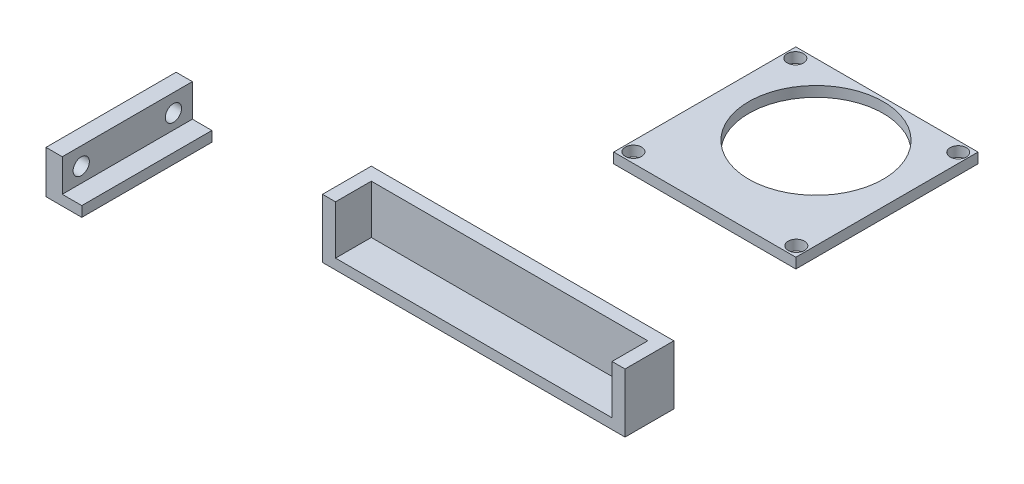
ISO-10303-21;
HEADER;
FILE_DESCRIPTION(('STEP AP214'),'2;1');
FILE_NAME('part.step','',(''),(''),'','','');
FILE_SCHEMA(('AUTOMOTIVE_DESIGN { 1 0 10303 214 1 1 1 1 }'));
ENDSEC;
DATA;
#1=APPLICATION_CONTEXT('core data for automotive mechanical design processes');
#2=APPLICATION_PROTOCOL_DEFINITION('international standard','automotive_design',2000,#1);
#3=PRODUCT_CONTEXT('',#1,'mechanical');
#4=PRODUCT('Part','Part','',(#3));
#5=PRODUCT_RELATED_PRODUCT_CATEGORY('part','',(#4));
#6=PRODUCT_DEFINITION_FORMATION('','',#4);
#7=PRODUCT_DEFINITION_CONTEXT('part definition',#1,'design');
#8=PRODUCT_DEFINITION('design','',#6,#7);
#9=PRODUCT_DEFINITION_SHAPE('','',#8);
#10=(LENGTH_UNIT() NAMED_UNIT(*) SI_UNIT(.MILLI.,.METRE.));
#11=(NAMED_UNIT(*) PLANE_ANGLE_UNIT() SI_UNIT($,.RADIAN.));
#12=(NAMED_UNIT(*) SI_UNIT($,.STERADIAN.) SOLID_ANGLE_UNIT());
#13=UNCERTAINTY_MEASURE_WITH_UNIT(LENGTH_MEASURE(1.E-05),#10,'distance_accuracy_value','');
#14=(GEOMETRIC_REPRESENTATION_CONTEXT(3) GLOBAL_UNCERTAINTY_ASSIGNED_CONTEXT((#13)) GLOBAL_UNIT_ASSIGNED_CONTEXT((#10,
#11,#12)) REPRESENTATION_CONTEXT('',''));
#15=CARTESIAN_POINT('',(0.,0.,0.));
#16=DIRECTION('',(0.,0.,1.));
#17=DIRECTION('',(1.,0.,0.));
#18=AXIS2_PLACEMENT_3D('',#15,#16,#17);
#19=CARTESIAN_POINT('',(-33.6549999999999,0.,0.));
#20=DIRECTION('',(1.,0.,0.));
#21=DIRECTION('',(0.,0.,-1.));
#22=AXIS2_PLACEMENT_3D('',#19,#20,#21);
#23=PLANE('',#22);
#24=DIRECTION('',(0.,-1.,0.));
#25=VECTOR('',#24,1.);
#26=CARTESIAN_POINT('',(-33.6549999999999,0.,-167.64));
#27=LINE('',#26,#25);
#28=CARTESIAN_POINT('',(-33.6549999999999,2.,-167.64));
#29=VERTEX_POINT('',#28);
#30=CARTESIAN_POINT('',(-33.6549999999999,0.,-167.64));
#31=VERTEX_POINT('',#30);
#32=EDGE_CURVE('E126',#29,#31,#27,.T.);
#33=ORIENTED_EDGE('',*,*,#32,.F.);
#34=DIRECTION('',(0.,0.,-1.));
#35=VECTOR('',#34,1.);
#36=CARTESIAN_POINT('',(-33.6549999999999,2.,0.));
#37=LINE('',#36,#35);
#38=CARTESIAN_POINT('',(-33.6549999999999,2.,-142.24));
#39=VERTEX_POINT('',#38);
#40=EDGE_CURVE('E129',#39,#29,#37,.T.);
#41=ORIENTED_EDGE('',*,*,#40,.F.);
#42=DIRECTION('',(0.,-1.,0.));
#43=VECTOR('',#42,1.);
#44=CARTESIAN_POINT('',(-33.6549999999999,2.,-142.24));
#45=LINE('',#44,#43);
#46=CARTESIAN_POINT('',(-33.6549999999999,0.,-142.24));
#47=VERTEX_POINT('',#46);
#48=EDGE_CURVE('E112',#39,#47,#45,.T.);
#49=ORIENTED_EDGE('',*,*,#48,.T.);
#50=DIRECTION('',(0.,0.,-1.));
#51=VECTOR('',#50,1.);
#52=CARTESIAN_POINT('',(-33.6549999999999,0.,0.));
#53=LINE('',#52,#51);
#54=EDGE_CURVE('E121',#47,#31,#53,.T.);
#55=ORIENTED_EDGE('',*,*,#54,.T.);
#56=EDGE_LOOP('',(#33,#41,#49,#55));
#57=FACE_BOUND('',#56,.T.);
#58=ADVANCED_FACE('F57',(#57),#23,.T.);
#59=CARTESIAN_POINT('',(0.,0.,-167.64));
#60=DIRECTION('',(0.,0.,-1.));
#61=DIRECTION('',(-1.,0.,0.));
#62=AXIS2_PLACEMENT_3D('',#59,#60,#61);
#63=PLANE('',#62);
#64=DIRECTION('',(1.,0.,0.));
#65=VECTOR('',#64,1.);
#66=CARTESIAN_POINT('',(-2.53999999999989,2.,-167.64));
#67=LINE('',#66,#65);
#68=CARTESIAN_POINT('',(-37.4649999999999,2.,-167.64));
#69=VERTEX_POINT('',#68);
#70=EDGE_CURVE('E133',#69,#29,#67,.T.);
#71=ORIENTED_EDGE('',*,*,#70,.T.);
#72=ORIENTED_EDGE('',*,*,#32,.T.);
#73=DIRECTION('',(-1.,0.,0.));
#74=VECTOR('',#73,1.);
#75=CARTESIAN_POINT('',(56.515,0.,-167.64));
#76=LINE('',#75,#74);
#77=CARTESIAN_POINT('',(-40.6399999999999,0.,-167.64));
#78=VERTEX_POINT('',#77);
#79=EDGE_CURVE('E65',#31,#78,#76,.T.);
#80=ORIENTED_EDGE('',*,*,#79,.T.);
#81=DIRECTION('',(0.,-1.,0.));
#82=VECTOR('',#81,1.);
#83=CARTESIAN_POINT('',(-40.6399999999999,2.,-167.64));
#84=LINE('',#83,#82);
#85=CARTESIAN_POINT('',(-40.6399999999999,8.35,-167.64));
#86=VERTEX_POINT('',#85);
#87=EDGE_CURVE('E134',#86,#78,#84,.T.);
#88=ORIENTED_EDGE('',*,*,#87,.F.);
#89=DIRECTION('',(-1.,0.,0.));
#90=VECTOR('',#89,1.);
#91=CARTESIAN_POINT('',(53.9750000000001,8.35,-167.64));
#92=LINE('',#91,#90);
#93=CARTESIAN_POINT('',(-37.4649999999999,8.35,-167.64));
#94=VERTEX_POINT('',#93);
#95=EDGE_CURVE('E169',#94,#86,#92,.T.);
#96=ORIENTED_EDGE('',*,*,#95,.F.);
#97=DIRECTION('',(0.,-1.,0.));
#98=VECTOR('',#97,1.);
#99=CARTESIAN_POINT('',(-37.4649999999999,8.35,-167.64));
#100=LINE('',#99,#98);
#101=EDGE_CURVE('E78',#94,#69,#100,.T.);
#102=ORIENTED_EDGE('',*,*,#101,.T.);
#103=EDGE_LOOP('',(#71,#72,#80,#88,#96,#102));
#104=FACE_BOUND('',#103,.T.);
#105=ADVANCED_FACE('F137',(#104),#63,.T.);
#106=CARTESIAN_POINT('',(0.,2.,0.));
#107=DIRECTION('',(0.,1.,0.));
#108=DIRECTION('',(0.,0.,1.));
#109=AXIS2_PLACEMENT_3D('',#106,#107,#108);
#110=PLANE('',#109);
#111=DIRECTION('',(1.,0.,0.));
#112=VECTOR('',#111,1.);
#113=CARTESIAN_POINT('',(-2.54,2.,-142.24));
#114=LINE('',#113,#112);
#115=CARTESIAN_POINT('',(-37.4649999999999,2.,-142.24));
#116=VERTEX_POINT('',#115);
#117=EDGE_CURVE('E12',#116,#39,#114,.T.);
#118=ORIENTED_EDGE('',*,*,#117,.T.);
#119=ORIENTED_EDGE('',*,*,#40,.T.);
#120=ORIENTED_EDGE('',*,*,#70,.F.);
#121=DIRECTION('',(0.,0.,-1.));
#122=VECTOR('',#121,1.);
#123=CARTESIAN_POINT('',(-37.4649999999999,2.,0.));
#124=LINE('',#123,#122);
#125=EDGE_CURVE('E164',#116,#69,#124,.T.);
#126=ORIENTED_EDGE('',*,*,#125,.F.);
#127=EDGE_LOOP('',(#118,#119,#120,#126));
#128=FACE_BOUND('',#127,.T.);
#129=ADVANCED_FACE('F177',(#128),#110,.T.);
#130=CARTESIAN_POINT('',(0.,0.,0.));
#131=DIRECTION('',(0.,1.,0.));
#132=DIRECTION('',(0.,0.,1.));
#133=AXIS2_PLACEMENT_3D('',#130,#131,#132);
#134=PLANE('',#133);
#135=ORIENTED_EDGE('',*,*,#54,.F.);
#136=DIRECTION('',(1.,0.,0.));
#137=VECTOR('',#136,1.);
#138=CARTESIAN_POINT('',(-2.54,0.,-142.24));
#139=LINE('',#138,#137);
#140=CARTESIAN_POINT('',(-40.6399999999999,0.,-142.24));
#141=VERTEX_POINT('',#140);
#142=EDGE_CURVE('E109',#141,#47,#139,.T.);
#143=ORIENTED_EDGE('',*,*,#142,.F.);
#144=DIRECTION('',(0.,0.,-1.));
#145=VECTOR('',#144,1.);
#146=CARTESIAN_POINT('',(-40.6399999999999,0.,-167.64));
#147=LINE('',#146,#145);
#148=EDGE_CURVE('E135',#141,#78,#147,.T.);
#149=ORIENTED_EDGE('',*,*,#148,.T.);
#150=ORIENTED_EDGE('',*,*,#79,.F.);
#151=EDGE_LOOP('',(#135,#143,#149,#150));
#152=FACE_BOUND('',#151,.T.);
#153=ADVANCED_FACE('F122',(#152),#134,.F.);
#154=CARTESIAN_POINT('',(-2.54,2.,-142.24));
#155=DIRECTION('',(0.,0.,-1.));
#156=DIRECTION('',(-1.,0.,0.));
#157=AXIS2_PLACEMENT_3D('',#154,#155,#156);
#158=PLANE('',#157);
#159=ORIENTED_EDGE('',*,*,#48,.F.);
#160=ORIENTED_EDGE('',*,*,#117,.F.);
#161=DIRECTION('',(0.,-1.,0.));
#162=VECTOR('',#161,1.);
#163=CARTESIAN_POINT('',(-37.4649999999999,8.35,-142.24));
#164=LINE('',#163,#162);
#165=CARTESIAN_POINT('',(-37.4649999999999,8.35,-142.24));
#166=VERTEX_POINT('',#165);
#167=EDGE_CURVE('E171',#166,#116,#164,.T.);
#168=ORIENTED_EDGE('',*,*,#167,.F.);
#169=DIRECTION('',(1.,0.,0.));
#170=VECTOR('',#169,1.);
#171=CARTESIAN_POINT('',(53.9750000000001,8.35,-142.24));
#172=LINE('',#171,#170);
#173=CARTESIAN_POINT('',(-40.6399999999999,8.35,-142.24));
#174=VERTEX_POINT('',#173);
#175=EDGE_CURVE('E163',#174,#166,#172,.T.);
#176=ORIENTED_EDGE('',*,*,#175,.F.);
#177=DIRECTION('',(0.,-1.,0.));
#178=VECTOR('',#177,1.);
#179=CARTESIAN_POINT('',(-40.6399999999999,2.,-142.24));
#180=LINE('',#179,#178);
#181=EDGE_CURVE('E115',#174,#141,#180,.T.);
#182=ORIENTED_EDGE('',*,*,#181,.T.);
#183=ORIENTED_EDGE('',*,*,#142,.T.);
#184=EDGE_LOOP('',(#159,#160,#168,#176,#182,#183));
#185=FACE_BOUND('',#184,.T.);
#186=ADVANCED_FACE('F59',(#185),#158,.F.);
#187=CARTESIAN_POINT('',(-32.9748719394654,4.8959716215613,-163.94));
#188=DIRECTION('',(-1.,0.,0.));
#189=DIRECTION('',(0.,0.,-1.));
#190=AXIS2_PLACEMENT_3D('',#187,#188,#189);
#191=CYLINDRICAL_SURFACE('',#190,1.58749999999999);
#192=CARTESIAN_POINT('',(-40.6399999999999,4.8959716215613,-163.94));
#193=DIRECTION('',(1.,0.,0.));
#194=DIRECTION('',(0.,0.,1.));
#195=AXIS2_PLACEMENT_3D('',#192,#193,#194);
#196=CIRCLE('',#195,1.58749999999999);
#197=CARTESIAN_POINT('',(-40.6399999999999,4.8959716215613,-162.3525));
#198=VERTEX_POINT('',#197);
#199=EDGE_CURVE('E151',#198,#198,#196,.T.);
#200=ORIENTED_EDGE('',*,*,#199,.F.);
#201=EDGE_LOOP('',(#200));
#202=FACE_BOUND('',#201,.T.);
#203=CARTESIAN_POINT('',(-37.4649999999999,4.8959716215613,-163.94));
#204=DIRECTION('',(-1.,0.,0.));
#205=DIRECTION('',(0.,0.,1.));
#206=AXIS2_PLACEMENT_3D('',#203,#204,#205);
#207=CIRCLE('',#206,1.58749999999999);
#208=CARTESIAN_POINT('',(-37.4649999999999,4.8959716215613,-162.3525));
#209=VERTEX_POINT('',#208);
#210=EDGE_CURVE('E148',#209,#209,#207,.F.);
#211=ORIENTED_EDGE('',*,*,#210,.T.);
#212=EDGE_LOOP('',(#211));
#213=FACE_BOUND('',#212,.T.);
#214=ADVANCED_FACE('F188',(#202,#213),#191,.F.);
#215=CARTESIAN_POINT('',(-32.9748719394654,4.8959716215613,-145.94));
#216=DIRECTION('',(-1.,0.,0.));
#217=DIRECTION('',(0.,0.,-1.));
#218=AXIS2_PLACEMENT_3D('',#215,#216,#217);
#219=CYLINDRICAL_SURFACE('',#218,1.58749999999999);
#220=CARTESIAN_POINT('',(-40.6399999999999,4.8959716215613,-145.94));
#221=DIRECTION('',(1.,0.,0.));
#222=DIRECTION('',(0.,0.,-1.));
#223=AXIS2_PLACEMENT_3D('',#220,#221,#222);
#224=CIRCLE('',#223,1.58749999999999);
#225=CARTESIAN_POINT('',(-40.6399999999999,4.8959716215613,-147.5275));
#226=VERTEX_POINT('',#225);
#227=EDGE_CURVE('E156',#226,#226,#224,.T.);
#228=ORIENTED_EDGE('',*,*,#227,.F.);
#229=EDGE_LOOP('',(#228));
#230=FACE_BOUND('',#229,.T.);
#231=CARTESIAN_POINT('',(-37.4649999999999,4.8959716215613,-145.94));
#232=DIRECTION('',(-1.,0.,0.));
#233=DIRECTION('',(0.,0.,1.));
#234=AXIS2_PLACEMENT_3D('',#231,#232,#233);
#235=CIRCLE('',#234,1.58749999999999);
#236=CARTESIAN_POINT('',(-37.4649999999999,4.8959716215613,-144.3525));
#237=VERTEX_POINT('',#236);
#238=EDGE_CURVE('E159',#237,#237,#235,.F.);
#239=ORIENTED_EDGE('',*,*,#238,.T.);
#240=EDGE_LOOP('',(#239));
#241=FACE_BOUND('',#240,.T.);
#242=ADVANCED_FACE('F192',(#230,#241),#219,.F.);
#243=CARTESIAN_POINT('',(-40.6399999999999,2.,-167.64));
#244=DIRECTION('',(1.,0.,0.));
#245=DIRECTION('',(0.,0.,1.));
#246=AXIS2_PLACEMENT_3D('',#243,#244,#245);
#247=PLANE('',#246);
#248=ORIENTED_EDGE('',*,*,#227,.T.);
#249=EDGE_LOOP('',(#248));
#250=FACE_BOUND('',#249,.T.);
#251=ORIENTED_EDGE('',*,*,#199,.T.);
#252=EDGE_LOOP('',(#251));
#253=FACE_BOUND('',#252,.T.);
#254=ORIENTED_EDGE('',*,*,#148,.F.);
#255=ORIENTED_EDGE('',*,*,#181,.F.);
#256=DIRECTION('',(0.,0.,1.));
#257=VECTOR('',#256,1.);
#258=CARTESIAN_POINT('',(-40.6399999999999,8.35,0.));
#259=LINE('',#258,#257);
#260=EDGE_CURVE('E142',#86,#174,#259,.T.);
#261=ORIENTED_EDGE('',*,*,#260,.F.);
#262=ORIENTED_EDGE('',*,*,#87,.T.);
#263=EDGE_LOOP('',(#254,#255,#261,#262));
#264=FACE_BOUND('',#263,.T.);
#265=ADVANCED_FACE('F141',(#250,#253,#264),#247,.F.);
#266=CARTESIAN_POINT('',(53.9750000000001,8.35,0.));
#267=DIRECTION('',(0.,-1.,0.));
#268=DIRECTION('',(0.,0.,-1.));
#269=AXIS2_PLACEMENT_3D('',#266,#267,#268);
#270=PLANE('',#269);
#271=ORIENTED_EDGE('',*,*,#260,.T.);
#272=ORIENTED_EDGE('',*,*,#175,.T.);
#273=DIRECTION('',(0.,0.,-1.));
#274=VECTOR('',#273,1.);
#275=CARTESIAN_POINT('',(-37.4649999999999,8.35,0.));
#276=LINE('',#275,#274);
#277=EDGE_CURVE('E167',#166,#94,#276,.T.);
#278=ORIENTED_EDGE('',*,*,#277,.T.);
#279=ORIENTED_EDGE('',*,*,#95,.T.);
#280=EDGE_LOOP('',(#271,#272,#278,#279));
#281=FACE_BOUND('',#280,.T.);
#282=ADVANCED_FACE('F191',(#281),#270,.F.);
#283=CARTESIAN_POINT('',(-37.4649999999999,8.35,0.));
#284=DIRECTION('',(1.,0.,0.));
#285=DIRECTION('',(0.,0.,1.));
#286=AXIS2_PLACEMENT_3D('',#283,#284,#285);
#287=PLANE('',#286);
#288=ORIENTED_EDGE('',*,*,#238,.F.);
#289=EDGE_LOOP('',(#288));
#290=FACE_BOUND('',#289,.T.);
#291=ORIENTED_EDGE('',*,*,#210,.F.);
#292=EDGE_LOOP('',(#291));
#293=FACE_BOUND('',#292,.T.);
#294=ORIENTED_EDGE('',*,*,#125,.T.);
#295=ORIENTED_EDGE('',*,*,#101,.F.);
#296=ORIENTED_EDGE('',*,*,#277,.F.);
#297=ORIENTED_EDGE('',*,*,#167,.T.);
#298=EDGE_LOOP('',(#294,#295,#296,#297));
#299=FACE_BOUND('',#298,.T.);
#300=ADVANCED_FACE('F176',(#290,#293,#299),#287,.T.);
#301=CLOSED_SHELL('',(#58,#105,#129,#153,#186,#214,#242,#265,#282,#300));
#302=MANIFOLD_SOLID_BREP('B2',#301);
#303=CARTESIAN_POINT('',(56.515,2.,-158.115));
#304=DIRECTION('',(0.,0.,1.));
#305=DIRECTION('',(1.,0.,0.));
#306=AXIS2_PLACEMENT_3D('',#303,#304,#305);
#307=PLANE('',#306);
#308=DIRECTION('',(1.,0.,0.));
#309=VECTOR('',#308,1.);
#310=CARTESIAN_POINT('',(0.,0.,-158.115));
#311=LINE('',#310,#309);
#312=CARTESIAN_POINT('',(-2.54,0.,-158.115));
#313=VERTEX_POINT('',#312);
#314=CARTESIAN_POINT('',(56.515,0.,-158.115));
#315=VERTEX_POINT('',#314);
#316=EDGE_CURVE('E437',#313,#315,#311,.T.);
#317=ORIENTED_EDGE('',*,*,#316,.T.);
#318=DIRECTION('',(0.,-1.,0.));
#319=VECTOR('',#318,1.);
#320=CARTESIAN_POINT('',(56.515,11.525,-158.115));
#321=LINE('',#320,#319);
#322=CARTESIAN_POINT('',(56.515,11.525,-158.115));
#323=VERTEX_POINT('',#322);
#324=EDGE_CURVE('E430',#323,#315,#321,.T.);
#325=ORIENTED_EDGE('',*,*,#324,.F.);
#326=DIRECTION('',(-1.,0.,0.));
#327=VECTOR('',#326,1.);
#328=CARTESIAN_POINT('',(0.,11.525,-158.115));
#329=LINE('',#328,#327);
#330=CARTESIAN_POINT('',(53.975,11.525,-158.115));
#331=VERTEX_POINT('',#330);
#332=EDGE_CURVE('E428',#323,#331,#329,.T.);
#333=ORIENTED_EDGE('',*,*,#332,.T.);
#334=DIRECTION('',(0.,-1.,0.));
#335=VECTOR('',#334,1.);
#336=CARTESIAN_POINT('',(53.975,11.525,-158.115));
#337=LINE('',#336,#335);
#338=CARTESIAN_POINT('',(53.975,2.,-158.115));
#339=VERTEX_POINT('',#338);
#340=EDGE_CURVE('E412',#331,#339,#337,.T.);
#341=ORIENTED_EDGE('',*,*,#340,.T.);
#342=DIRECTION('',(1.,0.,0.));
#343=VECTOR('',#342,1.);
#344=CARTESIAN_POINT('',(0.,2.,-158.115));
#345=LINE('',#344,#343);
#346=CARTESIAN_POINT('',(0.,2.,-158.115));
#347=VERTEX_POINT('',#346);
#348=EDGE_CURVE('E426',#347,#339,#345,.T.);
#349=ORIENTED_EDGE('',*,*,#348,.F.);
#350=DIRECTION('',(0.,-1.,0.));
#351=VECTOR('',#350,1.);
#352=CARTESIAN_POINT('',(0.,11.525,-158.115));
#353=LINE('',#352,#351);
#354=CARTESIAN_POINT('',(0.,11.525,-158.115));
#355=VERTEX_POINT('',#354);
#356=EDGE_CURVE('E483',#355,#347,#353,.T.);
#357=ORIENTED_EDGE('',*,*,#356,.F.);
#358=DIRECTION('',(-1.,0.,0.));
#359=VECTOR('',#358,1.);
#360=CARTESIAN_POINT('',(0.,11.525,-158.115));
#361=LINE('',#360,#359);
#362=CARTESIAN_POINT('',(-2.54,11.525,-158.115));
#363=VERTEX_POINT('',#362);
#364=EDGE_CURVE('E472',#355,#363,#361,.T.);
#365=ORIENTED_EDGE('',*,*,#364,.T.);
#366=DIRECTION('',(0.,-1.,0.));
#367=VECTOR('',#366,1.);
#368=CARTESIAN_POINT('',(-2.54,11.525,-158.115));
#369=LINE('',#368,#367);
#370=EDGE_CURVE('E486',#363,#313,#369,.T.);
#371=ORIENTED_EDGE('',*,*,#370,.T.);
#372=EDGE_LOOP('',(#317,#325,#333,#341,#349,#357,#365,#371));
#373=FACE_BOUND('',#372,.T.);
#374=ADVANCED_FACE('F344',(#373),#307,.T.);
#375=CARTESIAN_POINT('',(0.,2.,0.));
#376=DIRECTION('',(0.,1.,0.));
#377=DIRECTION('',(0.,0.,1.));
#378=AXIS2_PLACEMENT_3D('',#375,#376,#377);
#379=PLANE('',#378);
#380=DIRECTION('',(0.,0.,1.));
#381=VECTOR('',#380,1.);
#382=CARTESIAN_POINT('',(0.,2.,0.));
#383=LINE('',#382,#381);
#384=CARTESIAN_POINT('',(0.,2.,-165.1));
#385=VERTEX_POINT('',#384);
#386=EDGE_CURVE('E433',#385,#347,#383,.T.);
#387=ORIENTED_EDGE('',*,*,#386,.T.);
#388=ORIENTED_EDGE('',*,*,#348,.T.);
#389=DIRECTION('',(0.,0.,-1.));
#390=VECTOR('',#389,1.);
#391=CARTESIAN_POINT('',(53.975,2.,0.));
#392=LINE('',#391,#390);
#393=CARTESIAN_POINT('',(53.975,2.,-165.1));
#394=VERTEX_POINT('',#393);
#395=EDGE_CURVE('E408',#339,#394,#392,.T.);
#396=ORIENTED_EDGE('',*,*,#395,.T.);
#397=DIRECTION('',(-1.,0.,0.));
#398=VECTOR('',#397,1.);
#399=CARTESIAN_POINT('',(0.,2.,-165.1));
#400=LINE('',#399,#398);
#401=EDGE_CURVE('E420',#394,#385,#400,.T.);
#402=ORIENTED_EDGE('',*,*,#401,.T.);
#403=EDGE_LOOP('',(#387,#388,#396,#402));
#404=FACE_BOUND('',#403,.T.);
#405=ADVANCED_FACE('F346',(#404),#379,.T.);
#406=CARTESIAN_POINT('',(0.,0.,0.));
#407=DIRECTION('',(0.,1.,0.));
#408=DIRECTION('',(0.,0.,1.));
#409=AXIS2_PLACEMENT_3D('',#406,#407,#408);
#410=PLANE('',#409);
#411=ORIENTED_EDGE('',*,*,#316,.F.);
#412=DIRECTION('',(0.,0.,1.));
#413=VECTOR('',#412,1.);
#414=CARTESIAN_POINT('',(-2.53999999999998,0.,0.));
#415=LINE('',#414,#413);
#416=CARTESIAN_POINT('',(-2.54,0.,-167.64));
#417=VERTEX_POINT('',#416);
#418=EDGE_CURVE('E55',#417,#313,#415,.T.);
#419=ORIENTED_EDGE('',*,*,#418,.F.);
#420=DIRECTION('',(-1.,0.,0.));
#421=VECTOR('',#420,1.);
#422=CARTESIAN_POINT('',(56.515,0.,-167.64));
#423=LINE('',#422,#421);
#424=CARTESIAN_POINT('',(56.515,0.,-167.64));
#425=VERTEX_POINT('',#424);
#426=EDGE_CURVE('E489',#425,#417,#423,.T.);
#427=ORIENTED_EDGE('',*,*,#426,.F.);
#428=DIRECTION('',(0.,0.,-1.));
#429=VECTOR('',#428,1.);
#430=CARTESIAN_POINT('',(56.515,0.,0.));
#431=LINE('',#430,#429);
#432=EDGE_CURVE('E353',#315,#425,#431,.T.);
#433=ORIENTED_EDGE('',*,*,#432,.F.);
#434=EDGE_LOOP('',(#411,#419,#427,#433));
#435=FACE_BOUND('',#434,.T.);
#436=ADVANCED_FACE('F501',(#435),#410,.F.);
#437=CARTESIAN_POINT('',(0.,0.,-167.64));
#438=DIRECTION('',(0.,0.,-1.));
#439=DIRECTION('',(-1.,0.,0.));
#440=AXIS2_PLACEMENT_3D('',#437,#438,#439);
#441=PLANE('',#440);
#442=DIRECTION('',(0.,-1.,0.));
#443=VECTOR('',#442,1.);
#444=CARTESIAN_POINT('',(56.515,2.,-167.64));
#445=LINE('',#444,#443);
#446=CARTESIAN_POINT('',(56.515,11.525,-167.64));
#447=VERTEX_POINT('',#446);
#448=EDGE_CURVE('E436',#447,#425,#445,.T.);
#449=ORIENTED_EDGE('',*,*,#448,.T.);
#450=ORIENTED_EDGE('',*,*,#426,.T.);
#451=DIRECTION('',(0.,-1.,0.));
#452=VECTOR('',#451,1.);
#453=CARTESIAN_POINT('',(-2.54,2.,-167.64));
#454=LINE('',#453,#452);
#455=CARTESIAN_POINT('',(-2.54,11.525,-167.64));
#456=VERTEX_POINT('',#455);
#457=EDGE_CURVE('E366',#456,#417,#454,.T.);
#458=ORIENTED_EDGE('',*,*,#457,.F.);
#459=DIRECTION('',(1.,0.,0.));
#460=VECTOR('',#459,1.);
#461=CARTESIAN_POINT('',(0.,11.525,-167.64));
#462=LINE('',#461,#460);
#463=EDGE_CURVE('E453',#456,#447,#462,.T.);
#464=ORIENTED_EDGE('',*,*,#463,.T.);
#465=EDGE_LOOP('',(#449,#450,#458,#464));
#466=FACE_BOUND('',#465,.T.);
#467=ADVANCED_FACE('F497',(#466),#441,.T.);
#468=CARTESIAN_POINT('',(56.515,2.,-167.64));
#469=DIRECTION('',(1.,0.,0.));
#470=DIRECTION('',(0.,0.,-1.));
#471=AXIS2_PLACEMENT_3D('',#468,#469,#470);
#472=PLANE('',#471);
#473=ORIENTED_EDGE('',*,*,#324,.T.);
#474=ORIENTED_EDGE('',*,*,#432,.T.);
#475=ORIENTED_EDGE('',*,*,#448,.F.);
#476=DIRECTION('',(0.,0.,1.));
#477=VECTOR('',#476,1.);
#478=CARTESIAN_POINT('',(56.515,11.525,0.));
#479=LINE('',#478,#477);
#480=EDGE_CURVE('E456',#447,#323,#479,.T.);
#481=ORIENTED_EDGE('',*,*,#480,.T.);
#482=EDGE_LOOP('',(#473,#474,#475,#481));
#483=FACE_BOUND('',#482,.T.);
#484=ADVANCED_FACE('F521',(#483),#472,.T.);
#485=CARTESIAN_POINT('',(53.975,11.525,0.));
#486=DIRECTION('',(-1.,0.,0.));
#487=DIRECTION('',(0.,0.,1.));
#488=AXIS2_PLACEMENT_3D('',#485,#486,#487);
#489=PLANE('',#488);
#490=ORIENTED_EDGE('',*,*,#395,.F.);
#491=ORIENTED_EDGE('',*,*,#340,.F.);
#492=DIRECTION('',(0.,0.,-1.));
#493=VECTOR('',#492,1.);
#494=CARTESIAN_POINT('',(53.975,11.525,0.));
#495=LINE('',#494,#493);
#496=CARTESIAN_POINT('',(53.975,11.525,-165.1));
#497=VERTEX_POINT('',#496);
#498=EDGE_CURVE('E461',#331,#497,#495,.T.);
#499=ORIENTED_EDGE('',*,*,#498,.T.);
#500=DIRECTION('',(0.,-1.,0.));
#501=VECTOR('',#500,1.);
#502=CARTESIAN_POINT('',(53.975,11.525,-165.1));
#503=LINE('',#502,#501);
#504=EDGE_CURVE('E414',#497,#394,#503,.T.);
#505=ORIENTED_EDGE('',*,*,#504,.T.);
#506=EDGE_LOOP('',(#490,#491,#499,#505));
#507=FACE_BOUND('',#506,.T.);
#508=ADVANCED_FACE('F410',(#507),#489,.T.);
#509=CARTESIAN_POINT('',(0.,11.525,-165.1));
#510=DIRECTION('',(0.,0.,1.));
#511=DIRECTION('',(1.,0.,0.));
#512=AXIS2_PLACEMENT_3D('',#509,#510,#511);
#513=PLANE('',#512);
#514=ORIENTED_EDGE('',*,*,#401,.F.);
#515=ORIENTED_EDGE('',*,*,#504,.F.);
#516=DIRECTION('',(-1.,0.,0.));
#517=VECTOR('',#516,1.);
#518=CARTESIAN_POINT('',(0.,11.525,-165.1));
#519=LINE('',#518,#517);
#520=CARTESIAN_POINT('',(0.,11.525,-165.1));
#521=VERTEX_POINT('',#520);
#522=EDGE_CURVE('E464',#497,#521,#519,.T.);
#523=ORIENTED_EDGE('',*,*,#522,.T.);
#524=DIRECTION('',(0.,-1.,0.));
#525=VECTOR('',#524,1.);
#526=CARTESIAN_POINT('',(0.,11.525,-165.1));
#527=LINE('',#526,#525);
#528=EDGE_CURVE('E480',#521,#385,#527,.T.);
#529=ORIENTED_EDGE('',*,*,#528,.T.);
#530=EDGE_LOOP('',(#514,#515,#523,#529));
#531=FACE_BOUND('',#530,.T.);
#532=ADVANCED_FACE('F513',(#531),#513,.T.);
#533=CARTESIAN_POINT('',(0.,11.525,0.));
#534=DIRECTION('',(1.,0.,0.));
#535=DIRECTION('',(0.,0.,-1.));
#536=AXIS2_PLACEMENT_3D('',#533,#534,#535);
#537=PLANE('',#536);
#538=ORIENTED_EDGE('',*,*,#386,.F.);
#539=ORIENTED_EDGE('',*,*,#528,.F.);
#540=DIRECTION('',(0.,0.,1.));
#541=VECTOR('',#540,1.);
#542=CARTESIAN_POINT('',(0.,11.525,0.));
#543=LINE('',#542,#541);
#544=EDGE_CURVE('E468',#521,#355,#543,.T.);
#545=ORIENTED_EDGE('',*,*,#544,.T.);
#546=ORIENTED_EDGE('',*,*,#356,.T.);
#547=EDGE_LOOP('',(#538,#539,#545,#546));
#548=FACE_BOUND('',#547,.T.);
#549=ADVANCED_FACE('F510',(#548),#537,.T.);
#550=CARTESIAN_POINT('',(-2.54,2.,-167.64));
#551=DIRECTION('',(-1.,0.,0.));
#552=DIRECTION('',(0.,0.,1.));
#553=AXIS2_PLACEMENT_3D('',#550,#551,#552);
#554=PLANE('',#553);
#555=ORIENTED_EDGE('',*,*,#418,.T.);
#556=ORIENTED_EDGE('',*,*,#370,.F.);
#557=DIRECTION('',(0.,0.,-1.));
#558=VECTOR('',#557,1.);
#559=CARTESIAN_POINT('',(-2.54,11.525,0.));
#560=LINE('',#559,#558);
#561=EDGE_CURVE('E444',#363,#456,#560,.T.);
#562=ORIENTED_EDGE('',*,*,#561,.T.);
#563=ORIENTED_EDGE('',*,*,#457,.T.);
#564=EDGE_LOOP('',(#555,#556,#562,#563));
#565=FACE_BOUND('',#564,.T.);
#566=ADVANCED_FACE('F502',(#565),#554,.T.);
#567=CARTESIAN_POINT('',(0.,11.525,0.));
#568=DIRECTION('',(0.,-1.,0.));
#569=DIRECTION('',(0.,0.,-1.));
#570=AXIS2_PLACEMENT_3D('',#567,#568,#569);
#571=PLANE('',#570);
#572=ORIENTED_EDGE('',*,*,#561,.F.);
#573=ORIENTED_EDGE('',*,*,#364,.F.);
#574=ORIENTED_EDGE('',*,*,#544,.F.);
#575=ORIENTED_EDGE('',*,*,#522,.F.);
#576=ORIENTED_EDGE('',*,*,#498,.F.);
#577=ORIENTED_EDGE('',*,*,#332,.F.);
#578=ORIENTED_EDGE('',*,*,#480,.F.);
#579=ORIENTED_EDGE('',*,*,#463,.F.);
#580=EDGE_LOOP('',(#572,#573,#574,#575,#576,#577,#578,#579));
#581=FACE_BOUND('',#580,.T.);
#582=ADVANCED_FACE('F506',(#581),#571,.F.);
#583=CLOSED_SHELL('',(#374,#405,#436,#467,#484,#508,#532,#549,#566,#582));
#584=MANIFOLD_SOLID_BREP('B6',#583);
#585=CARTESIAN_POINT('',(0.,0.,-203.2));
#586=DIRECTION('',(0.,0.,-1.));
#587=DIRECTION('',(-1.,0.,0.));
#588=AXIS2_PLACEMENT_3D('',#585,#586,#587);
#589=PLANE('',#588);
#590=DIRECTION('',(-1.,0.,0.));
#591=VECTOR('',#590,1.);
#592=CARTESIAN_POINT('',(0.,2.,-203.2));
#593=LINE('',#592,#591);
#594=CARTESIAN_POINT('',(44.7675,2.,-203.2));
#595=VERTEX_POINT('',#594);
#596=CARTESIAN_POINT('',(9.20750000000003,2.,-203.2));
#597=VERTEX_POINT('',#596);
#598=EDGE_CURVE('E342',#595,#597,#593,.T.);
#599=ORIENTED_EDGE('',*,*,#598,.T.);
#600=DIRECTION('',(0.,1.,0.));
#601=VECTOR('',#600,1.);
#602=CARTESIAN_POINT('',(9.20750000000003,2.,-203.2));
#603=LINE('',#602,#601);
#604=CARTESIAN_POINT('',(9.20750000000003,0.,-203.2));
#605=VERTEX_POINT('',#604);
#606=EDGE_CURVE('E719',#605,#597,#603,.T.);
#607=ORIENTED_EDGE('',*,*,#606,.F.);
#608=DIRECTION('',(-1.,0.,0.));
#609=VECTOR('',#608,1.);
#610=CARTESIAN_POINT('',(0.,0.,-203.2));
#611=LINE('',#610,#609);
#612=CARTESIAN_POINT('',(44.7675,0.,-203.2));
#613=VERTEX_POINT('',#612);
#614=EDGE_CURVE('E673',#613,#605,#611,.T.);
#615=ORIENTED_EDGE('',*,*,#614,.F.);
#616=DIRECTION('',(0.,-1.,0.));
#617=VECTOR('',#616,1.);
#618=CARTESIAN_POINT('',(44.7675,2.,-203.2));
#619=LINE('',#618,#617);
#620=EDGE_CURVE('E668',#595,#613,#619,.T.);
#621=ORIENTED_EDGE('',*,*,#620,.F.);
#622=EDGE_LOOP('',(#599,#607,#615,#621));
#623=FACE_BOUND('',#622,.T.);
#624=ADVANCED_FACE('F665',(#623),#589,.F.);
#625=CARTESIAN_POINT('',(42.8844831199394,2.,-236.783908574252));
#626=DIRECTION('',(0.,-1.,0.));
#627=DIRECTION('',(0.,0.,-1.));
#628=AXIS2_PLACEMENT_3D('',#625,#626,#627);
#629=CYLINDRICAL_SURFACE('',#628,1.5875);
#630=CARTESIAN_POINT('',(42.8844831199394,2.,-236.783908574252));
#631=DIRECTION('',(0.,1.,0.));
#632=DIRECTION('',(0.,0.,-1.));
#633=AXIS2_PLACEMENT_3D('',#630,#631,#632);
#634=CIRCLE('',#633,1.5875);
#635=CARTESIAN_POINT('',(42.8844831199394,2.,-238.371408574252));
#636=VERTEX_POINT('',#635);
#637=EDGE_CURVE('E759',#636,#636,#634,.T.);
#638=ORIENTED_EDGE('',*,*,#637,.T.);
#639=EDGE_LOOP('',(#638));
#640=FACE_BOUND('',#639,.T.);
#641=CARTESIAN_POINT('',(42.8844831199394,0.,-236.783908574252));
#642=DIRECTION('',(0.,1.,0.));
#643=DIRECTION('',(0.,0.,-1.));
#644=AXIS2_PLACEMENT_3D('',#641,#642,#643);
#645=CIRCLE('',#644,1.5875);
#646=CARTESIAN_POINT('',(42.8844831199394,0.,-238.371408574252));
#647=VERTEX_POINT('',#646);
#648=EDGE_CURVE('E762',#647,#647,#645,.T.);
#649=ORIENTED_EDGE('',*,*,#648,.F.);
#650=EDGE_LOOP('',(#649));
#651=FACE_BOUND('',#650,.T.);
#652=ADVANCED_FACE('F786',(#640,#651),#629,.F.);
#653=CARTESIAN_POINT('',(11.0905168800607,2.,-205.176091425748));
#654=DIRECTION('',(0.,-1.,0.));
#655=DIRECTION('',(0.,0.,-1.));
#656=AXIS2_PLACEMENT_3D('',#653,#654,#655);
#657=CYLINDRICAL_SURFACE('',#656,1.5875);
#658=CARTESIAN_POINT('',(11.0905168800607,2.,-205.176091425748));
#659=DIRECTION('',(0.,1.,0.));
#660=DIRECTION('',(0.,0.,-1.));
#661=AXIS2_PLACEMENT_3D('',#658,#659,#660);
#662=CIRCLE('',#661,1.5875);
#663=CARTESIAN_POINT('',(11.0905168800607,2.,-206.763591425748));
#664=VERTEX_POINT('',#663);
#665=EDGE_CURVE('E747',#664,#664,#662,.T.);
#666=ORIENTED_EDGE('',*,*,#665,.T.);
#667=EDGE_LOOP('',(#666));
#668=FACE_BOUND('',#667,.T.);
#669=CARTESIAN_POINT('',(11.0905168800607,0.,-205.176091425748));
#670=DIRECTION('',(0.,1.,0.));
#671=DIRECTION('',(0.,0.,-1.));
#672=AXIS2_PLACEMENT_3D('',#669,#670,#671);
#673=CIRCLE('',#672,1.5875);
#674=CARTESIAN_POINT('',(11.0905168800607,0.,-206.763591425748));
#675=VERTEX_POINT('',#674);
#676=EDGE_CURVE('E750',#675,#675,#673,.T.);
#677=ORIENTED_EDGE('',*,*,#676,.F.);
#678=EDGE_LOOP('',(#677));
#679=FACE_BOUND('',#678,.T.);
#680=ADVANCED_FACE('F789',(#668,#679),#657,.F.);
#681=CARTESIAN_POINT('',(11.0905168800607,2.,-236.783908574252));
#682=DIRECTION('',(0.,-1.,0.));
#683=DIRECTION('',(0.,0.,-1.));
#684=AXIS2_PLACEMENT_3D('',#681,#682,#683);
#685=CYLINDRICAL_SURFACE('',#684,1.5875);
#686=CARTESIAN_POINT('',(11.0905168800607,2.,-236.783908574252));
#687=DIRECTION('',(0.,1.,0.));
#688=DIRECTION('',(0.,0.,1.));
#689=AXIS2_PLACEMENT_3D('',#686,#687,#688);
#690=CIRCLE('',#689,1.5875);
#691=CARTESIAN_POINT('',(11.0905168800607,2.,-235.196408574252));
#692=VERTEX_POINT('',#691);
#693=EDGE_CURVE('E732',#692,#692,#690,.T.);
#694=ORIENTED_EDGE('',*,*,#693,.T.);
#695=EDGE_LOOP('',(#694));
#696=FACE_BOUND('',#695,.T.);
#697=CARTESIAN_POINT('',(11.0905168800607,0.,-236.783908574252));
#698=DIRECTION('',(0.,1.,0.));
#699=DIRECTION('',(0.,0.,1.));
#700=AXIS2_PLACEMENT_3D('',#697,#698,#699);
#701=CIRCLE('',#700,1.5875);
#702=CARTESIAN_POINT('',(11.0905168800607,0.,-235.196408574252));
#703=VERTEX_POINT('',#702);
#704=EDGE_CURVE('E744',#703,#703,#701,.T.);
#705=ORIENTED_EDGE('',*,*,#704,.F.);
#706=EDGE_LOOP('',(#705));
#707=FACE_BOUND('',#706,.T.);
#708=ADVANCED_FACE('F811',(#696,#707),#685,.F.);
#709=CARTESIAN_POINT('',(42.8844831199394,2.,-205.176091425748));
#710=DIRECTION('',(0.,-1.,0.));
#711=DIRECTION('',(0.,0.,-1.));
#712=AXIS2_PLACEMENT_3D('',#709,#710,#711);
#713=CYLINDRICAL_SURFACE('',#712,1.5875);
#714=CARTESIAN_POINT('',(42.8844831199394,2.,-205.176091425748));
#715=DIRECTION('',(0.,1.,0.));
#716=DIRECTION('',(0.,0.,1.));
#717=AXIS2_PLACEMENT_3D('',#714,#715,#716);
#718=CIRCLE('',#717,1.5875);
#719=CARTESIAN_POINT('',(42.8844831199394,2.,-203.588591425748));
#720=VERTEX_POINT('',#719);
#721=EDGE_CURVE('E753',#720,#720,#718,.T.);
#722=ORIENTED_EDGE('',*,*,#721,.T.);
#723=EDGE_LOOP('',(#722));
#724=FACE_BOUND('',#723,.T.);
#725=CARTESIAN_POINT('',(42.8844831199394,0.,-205.176091425748));
#726=DIRECTION('',(0.,1.,0.));
#727=DIRECTION('',(0.,0.,1.));
#728=AXIS2_PLACEMENT_3D('',#725,#726,#727);
#729=CIRCLE('',#728,1.5875);
#730=CARTESIAN_POINT('',(42.8844831199394,0.,-203.588591425748));
#731=VERTEX_POINT('',#730);
#732=EDGE_CURVE('E756',#731,#731,#729,.T.);
#733=ORIENTED_EDGE('',*,*,#732,.F.);
#734=EDGE_LOOP('',(#733));
#735=FACE_BOUND('',#734,.T.);
#736=ADVANCED_FACE('F814',(#724,#735),#713,.F.);
#737=CARTESIAN_POINT('',(26.9875,-37.1350471466637,-224.917));
#738=DIRECTION('',(0.,1.,0.));
#739=DIRECTION('',(0.,0.,1.));
#740=AXIS2_PLACEMENT_3D('',#737,#738,#739);
#741=CYLINDRICAL_SURFACE('',#740,13.129221828544);
#742=CARTESIAN_POINT('',(26.9875,0.,-224.917));
#743=DIRECTION('',(0.,1.,0.));
#744=DIRECTION('',(0.,0.,1.));
#745=AXIS2_PLACEMENT_3D('',#742,#743,#744);
#746=CIRCLE('',#745,13.129221828544);
#747=CARTESIAN_POINT('',(26.9875,0.,-211.787778171456));
#748=VERTEX_POINT('',#747);
#749=EDGE_CURVE('E765',#748,#748,#746,.F.);
#750=ORIENTED_EDGE('',*,*,#749,.T.);
#751=EDGE_LOOP('',(#750));
#752=FACE_BOUND('',#751,.T.);
#753=CARTESIAN_POINT('',(26.9875,2.,-224.917));
#754=DIRECTION('',(0.,1.,0.));
#755=DIRECTION('',(0.,0.,1.));
#756=AXIS2_PLACEMENT_3D('',#753,#754,#755);
#757=CIRCLE('',#756,13.129221828544);
#758=CARTESIAN_POINT('',(26.9875,2.,-211.787778171456));
#759=VERTEX_POINT('',#758);
#760=EDGE_CURVE('E770',#759,#759,#757,.T.);
#761=ORIENTED_EDGE('',*,*,#760,.T.);
#762=EDGE_LOOP('',(#761));
#763=FACE_BOUND('',#762,.T.);
#764=ADVANCED_FACE('F774',(#752,#763),#741,.F.);
#765=CARTESIAN_POINT('',(9.20750000000003,2.,-238.76));
#766=DIRECTION('',(0.,0.,1.));
#767=DIRECTION('',(1.,0.,0.));
#768=AXIS2_PLACEMENT_3D('',#765,#766,#767);
#769=PLANE('',#768);
#770=DIRECTION('',(-1.,0.,0.));
#771=VECTOR('',#770,1.);
#772=CARTESIAN_POINT('',(9.20750000000003,0.,-238.76));
#773=LINE('',#772,#771);
#774=CARTESIAN_POINT('',(44.7675,0.,-238.76));
#775=VERTEX_POINT('',#774);
#776=CARTESIAN_POINT('',(9.20750000000003,0.,-238.76));
#777=VERTEX_POINT('',#776);
#778=EDGE_CURVE('E734',#775,#777,#773,.T.);
#779=ORIENTED_EDGE('',*,*,#778,.T.);
#780=DIRECTION('',(0.,-1.,0.));
#781=VECTOR('',#780,1.);
#782=CARTESIAN_POINT('',(9.20750000000003,2.,-238.76));
#783=LINE('',#782,#781);
#784=CARTESIAN_POINT('',(9.20750000000003,2.,-238.76));
#785=VERTEX_POINT('',#784);
#786=EDGE_CURVE('E720',#785,#777,#783,.T.);
#787=ORIENTED_EDGE('',*,*,#786,.F.);
#788=DIRECTION('',(-1.,0.,0.));
#789=VECTOR('',#788,1.);
#790=CARTESIAN_POINT('',(9.20750000000003,2.,-238.76));
#791=LINE('',#790,#789);
#792=CARTESIAN_POINT('',(44.7675,2.,-238.76));
#793=VERTEX_POINT('',#792);
#794=EDGE_CURVE('E708',#793,#785,#791,.T.);
#795=ORIENTED_EDGE('',*,*,#794,.F.);
#796=DIRECTION('',(0.,-1.,0.));
#797=VECTOR('',#796,1.);
#798=CARTESIAN_POINT('',(44.7675,2.,-238.76));
#799=LINE('',#798,#797);
#800=EDGE_CURVE('E713',#793,#775,#799,.T.);
#801=ORIENTED_EDGE('',*,*,#800,.T.);
#802=EDGE_LOOP('',(#779,#787,#795,#801));
#803=FACE_BOUND('',#802,.T.);
#804=ADVANCED_FACE('F722',(#803),#769,.F.);
#805=CARTESIAN_POINT('',(0.,2.,0.));
#806=DIRECTION('',(0.,1.,0.));
#807=DIRECTION('',(0.,0.,1.));
#808=AXIS2_PLACEMENT_3D('',#805,#806,#807);
#809=PLANE('',#808);
#810=ORIENTED_EDGE('',*,*,#598,.F.);
#811=DIRECTION('',(0.,0.,-1.));
#812=VECTOR('',#811,1.);
#813=CARTESIAN_POINT('',(44.7675,2.,-238.76));
#814=LINE('',#813,#812);
#815=EDGE_CURVE('E702',#595,#793,#814,.T.);
#816=ORIENTED_EDGE('',*,*,#815,.T.);
#817=ORIENTED_EDGE('',*,*,#794,.T.);
#818=DIRECTION('',(0.,0.,1.));
#819=VECTOR('',#818,1.);
#820=CARTESIAN_POINT('',(9.20750000000003,2.,-238.76));
#821=LINE('',#820,#819);
#822=EDGE_CURVE('E710',#785,#597,#821,.T.);
#823=ORIENTED_EDGE('',*,*,#822,.T.);
#824=EDGE_LOOP('',(#810,#816,#817,#823));
#825=FACE_BOUND('',#824,.T.);
#826=ORIENTED_EDGE('',*,*,#760,.F.);
#827=EDGE_LOOP('',(#826));
#828=FACE_BOUND('',#827,.T.);
#829=ORIENTED_EDGE('',*,*,#721,.F.);
#830=EDGE_LOOP('',(#829));
#831=FACE_BOUND('',#830,.T.);
#832=ORIENTED_EDGE('',*,*,#693,.F.);
#833=EDGE_LOOP('',(#832));
#834=FACE_BOUND('',#833,.T.);
#835=ORIENTED_EDGE('',*,*,#665,.F.);
#836=EDGE_LOOP('',(#835));
#837=FACE_BOUND('',#836,.T.);
#838=ORIENTED_EDGE('',*,*,#637,.F.);
#839=EDGE_LOOP('',(#838));
#840=FACE_BOUND('',#839,.T.);
#841=ADVANCED_FACE('F704',(#825,#828,#831,#834,#837,#840),#809,.T.);
#842=CARTESIAN_POINT('',(0.,0.,0.));
#843=DIRECTION('',(0.,1.,0.));
#844=DIRECTION('',(0.,0.,1.));
#845=AXIS2_PLACEMENT_3D('',#842,#843,#844);
#846=PLANE('',#845);
#847=ORIENTED_EDGE('',*,*,#749,.F.);
#848=EDGE_LOOP('',(#847));
#849=FACE_BOUND('',#848,.T.);
#850=DIRECTION('',(0.,0.,-1.));
#851=VECTOR('',#850,1.);
#852=CARTESIAN_POINT('',(44.7675,0.,-238.76));
#853=LINE('',#852,#851);
#854=EDGE_CURVE('E716',#613,#775,#853,.T.);
#855=ORIENTED_EDGE('',*,*,#854,.F.);
#856=ORIENTED_EDGE('',*,*,#614,.T.);
#857=DIRECTION('',(0.,0.,1.));
#858=VECTOR('',#857,1.);
#859=CARTESIAN_POINT('',(9.20750000000003,0.,-238.76));
#860=LINE('',#859,#858);
#861=EDGE_CURVE('E729',#777,#605,#860,.T.);
#862=ORIENTED_EDGE('',*,*,#861,.F.);
#863=ORIENTED_EDGE('',*,*,#778,.F.);
#864=EDGE_LOOP('',(#855,#856,#862,#863));
#865=FACE_BOUND('',#864,.T.);
#866=ORIENTED_EDGE('',*,*,#704,.T.);
#867=EDGE_LOOP('',(#866));
#868=FACE_BOUND('',#867,.T.);
#869=ORIENTED_EDGE('',*,*,#676,.T.);
#870=EDGE_LOOP('',(#869));
#871=FACE_BOUND('',#870,.T.);
#872=ORIENTED_EDGE('',*,*,#732,.T.);
#873=EDGE_LOOP('',(#872));
#874=FACE_BOUND('',#873,.T.);
#875=ORIENTED_EDGE('',*,*,#648,.T.);
#876=EDGE_LOOP('',(#875));
#877=FACE_BOUND('',#876,.T.);
#878=ADVANCED_FACE('F739',(#849,#865,#868,#871,#874,#877),#846,.F.);
#879=CARTESIAN_POINT('',(9.20750000000003,2.,-238.76));
#880=DIRECTION('',(1.,0.,0.));
#881=DIRECTION('',(0.,0.,-1.));
#882=AXIS2_PLACEMENT_3D('',#879,#880,#881);
#883=PLANE('',#882);
#884=ORIENTED_EDGE('',*,*,#861,.T.);
#885=ORIENTED_EDGE('',*,*,#606,.T.);
#886=ORIENTED_EDGE('',*,*,#822,.F.);
#887=ORIENTED_EDGE('',*,*,#786,.T.);
#888=EDGE_LOOP('',(#884,#885,#886,#887));
#889=FACE_BOUND('',#888,.T.);
#890=ADVANCED_FACE('F742',(#889),#883,.F.);
#891=CARTESIAN_POINT('',(44.7675,2.,-238.76));
#892=DIRECTION('',(-1.,0.,0.));
#893=DIRECTION('',(0.,0.,1.));
#894=AXIS2_PLACEMENT_3D('',#891,#892,#893);
#895=PLANE('',#894);
#896=ORIENTED_EDGE('',*,*,#815,.F.);
#897=ORIENTED_EDGE('',*,*,#620,.T.);
#898=ORIENTED_EDGE('',*,*,#854,.T.);
#899=ORIENTED_EDGE('',*,*,#800,.F.);
#900=EDGE_LOOP('',(#896,#897,#898,#899));
#901=FACE_BOUND('',#900,.T.);
#902=ADVANCED_FACE('F714',(#901),#895,.F.);
#903=CLOSED_SHELL('',(#624,#652,#680,#708,#736,#764,#804,#841,#878,#890,#902));
#904=MANIFOLD_SOLID_BREP('B49',#903);
#905=ADVANCED_BREP_SHAPE_REPRESENTATION('',(#18,#302,#584,#904),#14);
#906=SHAPE_DEFINITION_REPRESENTATION(#9,#905);
ENDSEC;
END-ISO-10303-21;
